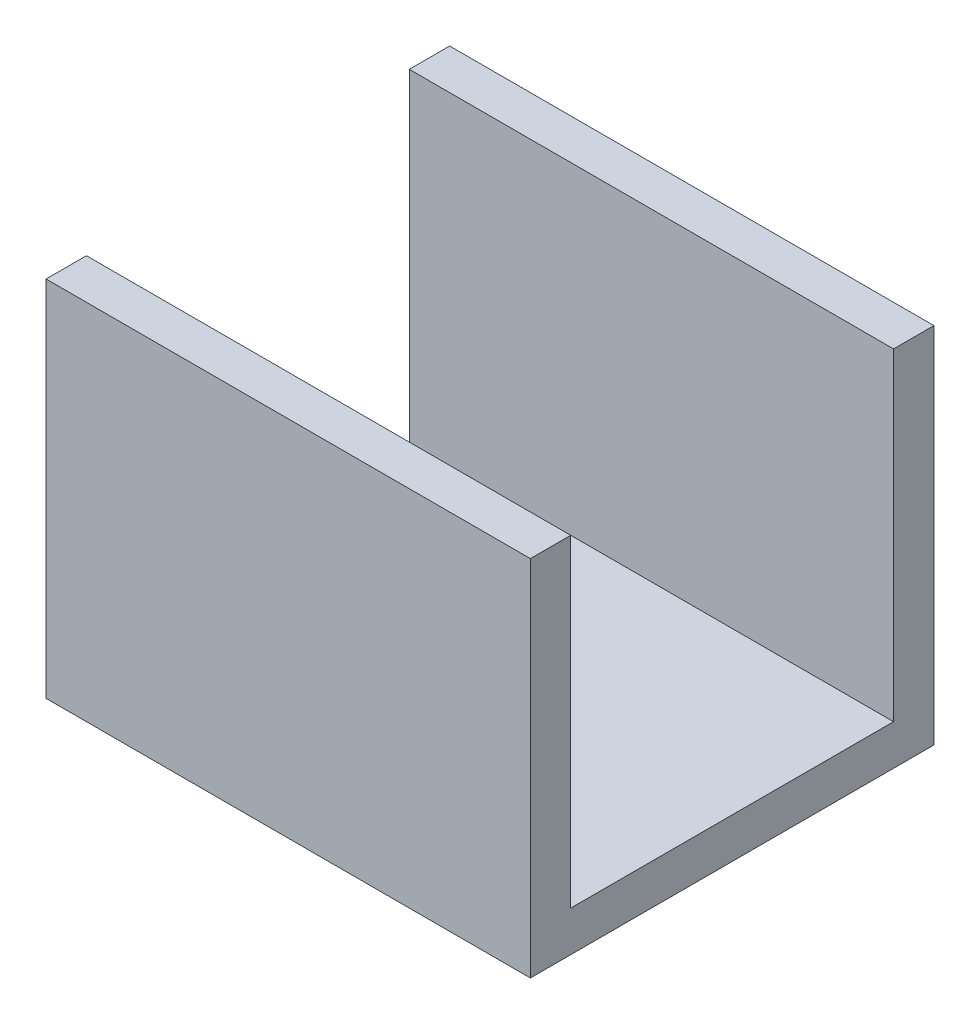
ISO-10303-21;
HEADER;
FILE_DESCRIPTION(('STEP AP214'),'2;1');
FILE_NAME('part.step','',(''),(''),'','','');
FILE_SCHEMA(('AUTOMOTIVE_DESIGN { 1 0 10303 214 1 1 1 1 }'));
ENDSEC;
DATA;
#1=APPLICATION_CONTEXT('core data for automotive mechanical design processes');
#2=APPLICATION_PROTOCOL_DEFINITION('international standard','automotive_design',2000,#1);
#3=PRODUCT_CONTEXT('',#1,'mechanical');
#4=PRODUCT('Part','Part','',(#3));
#5=PRODUCT_RELATED_PRODUCT_CATEGORY('part','',(#4));
#6=PRODUCT_DEFINITION_FORMATION('','',#4);
#7=PRODUCT_DEFINITION_CONTEXT('part definition',#1,'design');
#8=PRODUCT_DEFINITION('design','',#6,#7);
#9=PRODUCT_DEFINITION_SHAPE('','',#8);
#10=(LENGTH_UNIT() NAMED_UNIT(*) SI_UNIT(.MILLI.,.METRE.));
#11=(NAMED_UNIT(*) PLANE_ANGLE_UNIT() SI_UNIT($,.RADIAN.));
#12=(NAMED_UNIT(*) SI_UNIT($,.STERADIAN.) SOLID_ANGLE_UNIT());
#13=UNCERTAINTY_MEASURE_WITH_UNIT(LENGTH_MEASURE(1.E-05),#10,'distance_accuracy_value','');
#14=(GEOMETRIC_REPRESENTATION_CONTEXT(3) GLOBAL_UNCERTAINTY_ASSIGNED_CONTEXT((#13)) GLOBAL_UNIT_ASSIGNED_CONTEXT((#10,
#11,#12)) REPRESENTATION_CONTEXT('',''));
#15=CARTESIAN_POINT('',(0.,0.,0.));
#16=DIRECTION('',(0.,0.,1.));
#17=DIRECTION('',(1.,0.,0.));
#18=AXIS2_PLACEMENT_3D('',#15,#16,#17);
#19=CARTESIAN_POINT('',(0.,6.35,0.));
#20=DIRECTION('',(0.,-1.,0.));
#21=DIRECTION('',(0.,0.,-1.));
#22=AXIS2_PLACEMENT_3D('',#19,#20,#21);
#23=PLANE('',#22);
#24=DIRECTION('',(-1.,0.,0.));
#25=VECTOR('',#24,1.);
#26=CARTESIAN_POINT('',(-38.1,6.35,25.4));
#27=LINE('',#26,#25);
#28=CARTESIAN_POINT('',(38.1,6.35,25.4));
#29=VERTEX_POINT('',#28);
#30=CARTESIAN_POINT('',(-38.1,6.35,25.4));
#31=VERTEX_POINT('',#30);
#32=EDGE_CURVE('E54',#29,#31,#27,.T.);
#33=ORIENTED_EDGE('',*,*,#32,.F.);
#34=DIRECTION('',(0.,0.,-1.));
#35=VECTOR('',#34,1.);
#36=CARTESIAN_POINT('',(38.1,6.35,31.75));
#37=LINE('',#36,#35);
#38=CARTESIAN_POINT('',(38.1,6.35,-25.4));
#39=VERTEX_POINT('',#38);
#40=EDGE_CURVE('E151',#29,#39,#37,.T.);
#41=ORIENTED_EDGE('',*,*,#40,.T.);
#42=DIRECTION('',(1.,0.,0.));
#43=VECTOR('',#42,1.);
#44=CARTESIAN_POINT('',(-38.1,6.35,-25.4));
#45=LINE('',#44,#43);
#46=CARTESIAN_POINT('',(-38.1,6.35,-25.4));
#47=VERTEX_POINT('',#46);
#48=EDGE_CURVE('E126',#47,#39,#45,.T.);
#49=ORIENTED_EDGE('',*,*,#48,.F.);
#50=DIRECTION('',(0.,0.,1.));
#51=VECTOR('',#50,1.);
#52=CARTESIAN_POINT('',(-38.1,6.35,31.75));
#53=LINE('',#52,#51);
#54=EDGE_CURVE('E59',#47,#31,#53,.T.);
#55=ORIENTED_EDGE('',*,*,#54,.T.);
#56=EDGE_LOOP('',(#33,#41,#49,#55));
#57=FACE_BOUND('',#56,.T.);
#58=ADVANCED_FACE('F39',(#57),#23,.F.);
#59=CARTESIAN_POINT('',(38.1,6.35,31.75));
#60=DIRECTION('',(-1.,0.,0.));
#61=DIRECTION('',(0.,0.,1.));
#62=AXIS2_PLACEMENT_3D('',#59,#60,#61);
#63=PLANE('',#62);
#64=DIRECTION('',(0.,0.,-1.));
#65=VECTOR('',#64,1.);
#66=CARTESIAN_POINT('',(38.1,0.,31.75));
#67=LINE('',#66,#65);
#68=CARTESIAN_POINT('',(38.1,0.,31.75));
#69=VERTEX_POINT('',#68);
#70=CARTESIAN_POINT('',(38.1,0.,-31.75));
#71=VERTEX_POINT('',#70);
#72=EDGE_CURVE('E150',#69,#71,#67,.T.);
#73=ORIENTED_EDGE('',*,*,#72,.T.);
#74=DIRECTION('',(0.,-1.,0.));
#75=VECTOR('',#74,1.);
#76=CARTESIAN_POINT('',(38.1,6.35,-31.75));
#77=LINE('',#76,#75);
#78=CARTESIAN_POINT('',(38.1,57.15,-31.75));
#79=VERTEX_POINT('',#78);
#80=EDGE_CURVE('E11',#79,#71,#77,.T.);
#81=ORIENTED_EDGE('',*,*,#80,.F.);
#82=DIRECTION('',(0.,0.,-1.));
#83=VECTOR('',#82,1.);
#84=CARTESIAN_POINT('',(38.1,57.15,-31.75));
#85=LINE('',#84,#83);
#86=CARTESIAN_POINT('',(38.1,57.15,-25.4));
#87=VERTEX_POINT('',#86);
#88=EDGE_CURVE('E136',#87,#79,#85,.T.);
#89=ORIENTED_EDGE('',*,*,#88,.F.);
#90=DIRECTION('',(0.,-1.,0.));
#91=VECTOR('',#90,1.);
#92=CARTESIAN_POINT('',(38.1,57.15,-25.4));
#93=LINE('',#92,#91);
#94=EDGE_CURVE('E142',#87,#39,#93,.T.);
#95=ORIENTED_EDGE('',*,*,#94,.T.);
#96=ORIENTED_EDGE('',*,*,#40,.F.);
#97=DIRECTION('',(0.,-1.,0.));
#98=VECTOR('',#97,1.);
#99=CARTESIAN_POINT('',(38.1,57.15,25.4));
#100=LINE('',#99,#98);
#101=CARTESIAN_POINT('',(38.1,57.15,25.4));
#102=VERTEX_POINT('',#101);
#103=EDGE_CURVE('E118',#102,#29,#100,.T.);
#104=ORIENTED_EDGE('',*,*,#103,.F.);
#105=DIRECTION('',(0.,0.,-1.));
#106=VECTOR('',#105,1.);
#107=CARTESIAN_POINT('',(38.1,57.15,25.4));
#108=LINE('',#107,#106);
#109=CARTESIAN_POINT('',(38.1,57.15,31.75));
#110=VERTEX_POINT('',#109);
#111=EDGE_CURVE('E109',#110,#102,#108,.T.);
#112=ORIENTED_EDGE('',*,*,#111,.F.);
#113=DIRECTION('',(0.,-1.,0.));
#114=VECTOR('',#113,1.);
#115=CARTESIAN_POINT('',(38.1,6.35,31.75));
#116=LINE('',#115,#114);
#117=EDGE_CURVE('E155',#110,#69,#116,.T.);
#118=ORIENTED_EDGE('',*,*,#117,.T.);
#119=EDGE_LOOP('',(#73,#81,#89,#95,#96,#104,#112,#118));
#120=FACE_BOUND('',#119,.T.);
#121=ADVANCED_FACE('F41',(#120),#63,.F.);
#122=CARTESIAN_POINT('',(-38.1,6.35,-31.75));
#123=DIRECTION('',(0.,0.,1.));
#124=DIRECTION('',(1.,0.,0.));
#125=AXIS2_PLACEMENT_3D('',#122,#123,#124);
#126=PLANE('',#125);
#127=DIRECTION('',(-1.,0.,0.));
#128=VECTOR('',#127,1.);
#129=CARTESIAN_POINT('',(-38.1,0.,-31.75));
#130=LINE('',#129,#128);
#131=CARTESIAN_POINT('',(-38.1,0.,-31.75));
#132=VERTEX_POINT('',#131);
#133=EDGE_CURVE('E158',#71,#132,#130,.T.);
#134=ORIENTED_EDGE('',*,*,#133,.T.);
#135=DIRECTION('',(0.,-1.,0.));
#136=VECTOR('',#135,1.);
#137=CARTESIAN_POINT('',(-38.1,6.35,-31.75));
#138=LINE('',#137,#136);
#139=CARTESIAN_POINT('',(-38.1,57.15,-31.75));
#140=VERTEX_POINT('',#139);
#141=EDGE_CURVE('E47',#140,#132,#138,.T.);
#142=ORIENTED_EDGE('',*,*,#141,.F.);
#143=DIRECTION('',(-1.,0.,0.));
#144=VECTOR('',#143,1.);
#145=CARTESIAN_POINT('',(-38.1,57.15,-31.75));
#146=LINE('',#145,#144);
#147=EDGE_CURVE('E139',#79,#140,#146,.T.);
#148=ORIENTED_EDGE('',*,*,#147,.F.);
#149=ORIENTED_EDGE('',*,*,#80,.T.);
#150=EDGE_LOOP('',(#134,#142,#148,#149));
#151=FACE_BOUND('',#150,.T.);
#152=ADVANCED_FACE('F211',(#151),#126,.F.);
#153=CARTESIAN_POINT('',(-38.1,6.35,31.75));
#154=DIRECTION('',(1.,0.,0.));
#155=DIRECTION('',(0.,0.,-1.));
#156=AXIS2_PLACEMENT_3D('',#153,#154,#155);
#157=PLANE('',#156);
#158=DIRECTION('',(0.,0.,1.));
#159=VECTOR('',#158,1.);
#160=CARTESIAN_POINT('',(-38.1,0.,31.75));
#161=LINE('',#160,#159);
#162=CARTESIAN_POINT('',(-38.1,0.,31.75));
#163=VERTEX_POINT('',#162);
#164=EDGE_CURVE('E160',#132,#163,#161,.T.);
#165=ORIENTED_EDGE('',*,*,#164,.T.);
#166=DIRECTION('',(0.,-1.,0.));
#167=VECTOR('',#166,1.);
#168=CARTESIAN_POINT('',(-38.1,6.35,31.75));
#169=LINE('',#168,#167);
#170=CARTESIAN_POINT('',(-38.1,57.15,31.75));
#171=VERTEX_POINT('',#170);
#172=EDGE_CURVE('E122',#171,#163,#169,.T.);
#173=ORIENTED_EDGE('',*,*,#172,.F.);
#174=DIRECTION('',(0.,0.,1.));
#175=VECTOR('',#174,1.);
#176=CARTESIAN_POINT('',(-38.1,57.15,25.4));
#177=LINE('',#176,#175);
#178=CARTESIAN_POINT('',(-38.1,57.15,25.4));
#179=VERTEX_POINT('',#178);
#180=EDGE_CURVE('E107',#179,#171,#177,.T.);
#181=ORIENTED_EDGE('',*,*,#180,.F.);
#182=DIRECTION('',(0.,-1.,0.));
#183=VECTOR('',#182,1.);
#184=CARTESIAN_POINT('',(-38.1,57.15,25.4));
#185=LINE('',#184,#183);
#186=EDGE_CURVE('E113',#179,#31,#185,.T.);
#187=ORIENTED_EDGE('',*,*,#186,.T.);
#188=ORIENTED_EDGE('',*,*,#54,.F.);
#189=DIRECTION('',(0.,-1.,0.));
#190=VECTOR('',#189,1.);
#191=CARTESIAN_POINT('',(-38.1,57.15,-25.4));
#192=LINE('',#191,#190);
#193=CARTESIAN_POINT('',(-38.1,57.15,-25.4));
#194=VERTEX_POINT('',#193);
#195=EDGE_CURVE('E147',#194,#47,#192,.T.);
#196=ORIENTED_EDGE('',*,*,#195,.F.);
#197=DIRECTION('',(0.,0.,1.));
#198=VECTOR('',#197,1.);
#199=CARTESIAN_POINT('',(-38.1,57.15,-31.75));
#200=LINE('',#199,#198);
#201=EDGE_CURVE('E131',#140,#194,#200,.T.);
#202=ORIENTED_EDGE('',*,*,#201,.F.);
#203=ORIENTED_EDGE('',*,*,#141,.T.);
#204=EDGE_LOOP('',(#165,#173,#181,#187,#188,#196,#202,#203));
#205=FACE_BOUND('',#204,.T.);
#206=ADVANCED_FACE('F120',(#205),#157,.F.);
#207=CARTESIAN_POINT('',(-38.1,6.35,31.75));
#208=DIRECTION('',(0.,0.,-1.));
#209=DIRECTION('',(-1.,0.,0.));
#210=AXIS2_PLACEMENT_3D('',#207,#208,#209);
#211=PLANE('',#210);
#212=DIRECTION('',(1.,0.,0.));
#213=VECTOR('',#212,1.);
#214=CARTESIAN_POINT('',(-38.1,0.,31.75));
#215=LINE('',#214,#213);
#216=EDGE_CURVE('E153',#163,#69,#215,.T.);
#217=ORIENTED_EDGE('',*,*,#216,.T.);
#218=ORIENTED_EDGE('',*,*,#117,.F.);
#219=DIRECTION('',(1.,0.,0.));
#220=VECTOR('',#219,1.);
#221=CARTESIAN_POINT('',(-38.1,57.15,31.75));
#222=LINE('',#221,#220);
#223=EDGE_CURVE('E124',#171,#110,#222,.T.);
#224=ORIENTED_EDGE('',*,*,#223,.F.);
#225=ORIENTED_EDGE('',*,*,#172,.T.);
#226=EDGE_LOOP('',(#217,#218,#224,#225));
#227=FACE_BOUND('',#226,.T.);
#228=ADVANCED_FACE('F176',(#227),#211,.F.);
#229=CARTESIAN_POINT('',(0.,0.,0.));
#230=DIRECTION('',(0.,-1.,0.));
#231=DIRECTION('',(0.,0.,-1.));
#232=AXIS2_PLACEMENT_3D('',#229,#230,#231);
#233=PLANE('',#232);
#234=CARTESIAN_POINT('',(0.,0.,0.));
#235=DIRECTION('',(0.,-1.,0.));
#236=DIRECTION('',(0.,0.,-1.));
#237=AXIS2_PLACEMENT_3D('',#234,#235,#236);
#238=CIRCLE('',#237,3.175);
#239=CARTESIAN_POINT('',(0.,0.,-3.175));
#240=VERTEX_POINT('',#239);
#241=EDGE_CURVE('E181',#240,#240,#238,.T.);
#242=ORIENTED_EDGE('',*,*,#241,.F.);
#243=EDGE_LOOP('',(#242));
#244=FACE_BOUND('',#243,.T.);
#245=ORIENTED_EDGE('',*,*,#72,.F.);
#246=ORIENTED_EDGE('',*,*,#216,.F.);
#247=ORIENTED_EDGE('',*,*,#164,.F.);
#248=ORIENTED_EDGE('',*,*,#133,.F.);
#249=EDGE_LOOP('',(#245,#246,#247,#248));
#250=FACE_BOUND('',#249,.T.);
#251=ADVANCED_FACE('F174',(#244,#250),#233,.T.);
#252=CARTESIAN_POINT('',(-38.1,57.15,-25.4));
#253=DIRECTION('',(0.,0.,-1.));
#254=DIRECTION('',(-1.,0.,0.));
#255=AXIS2_PLACEMENT_3D('',#252,#253,#254);
#256=PLANE('',#255);
#257=ORIENTED_EDGE('',*,*,#48,.T.);
#258=ORIENTED_EDGE('',*,*,#94,.F.);
#259=DIRECTION('',(1.,0.,0.));
#260=VECTOR('',#259,1.);
#261=CARTESIAN_POINT('',(-38.1,57.15,-25.4));
#262=LINE('',#261,#260);
#263=EDGE_CURVE('E134',#194,#87,#262,.T.);
#264=ORIENTED_EDGE('',*,*,#263,.F.);
#265=ORIENTED_EDGE('',*,*,#195,.T.);
#266=EDGE_LOOP('',(#257,#258,#264,#265));
#267=FACE_BOUND('',#266,.T.);
#268=ADVANCED_FACE('F196',(#267),#256,.F.);
#269=CARTESIAN_POINT('',(0.,57.15,0.));
#270=DIRECTION('',(0.,1.,0.));
#271=DIRECTION('',(0.,0.,1.));
#272=AXIS2_PLACEMENT_3D('',#269,#270,#271);
#273=PLANE('',#272);
#274=ORIENTED_EDGE('',*,*,#201,.T.);
#275=ORIENTED_EDGE('',*,*,#263,.T.);
#276=ORIENTED_EDGE('',*,*,#88,.T.);
#277=ORIENTED_EDGE('',*,*,#147,.T.);
#278=EDGE_LOOP('',(#274,#275,#276,#277));
#279=FACE_BOUND('',#278,.T.);
#280=ADVANCED_FACE('F202',(#279),#273,.T.);
#281=CARTESIAN_POINT('',(-38.1,57.15,25.4));
#282=DIRECTION('',(0.,0.,1.));
#283=DIRECTION('',(1.,0.,0.));
#284=AXIS2_PLACEMENT_3D('',#281,#282,#283);
#285=PLANE('',#284);
#286=ORIENTED_EDGE('',*,*,#32,.T.);
#287=ORIENTED_EDGE('',*,*,#186,.F.);
#288=DIRECTION('',(-1.,0.,0.));
#289=VECTOR('',#288,1.);
#290=CARTESIAN_POINT('',(-38.1,57.15,25.4));
#291=LINE('',#290,#289);
#292=EDGE_CURVE('E102',#102,#179,#291,.T.);
#293=ORIENTED_EDGE('',*,*,#292,.F.);
#294=ORIENTED_EDGE('',*,*,#103,.T.);
#295=EDGE_LOOP('',(#286,#287,#293,#294));
#296=FACE_BOUND('',#295,.T.);
#297=ADVANCED_FACE('F116',(#296),#285,.F.);
#298=CARTESIAN_POINT('',(0.,57.15,0.));
#299=DIRECTION('',(0.,1.,0.));
#300=DIRECTION('',(0.,0.,1.));
#301=AXIS2_PLACEMENT_3D('',#298,#299,#300);
#302=PLANE('',#301);
#303=ORIENTED_EDGE('',*,*,#180,.T.);
#304=ORIENTED_EDGE('',*,*,#223,.T.);
#305=ORIENTED_EDGE('',*,*,#111,.T.);
#306=ORIENTED_EDGE('',*,*,#292,.T.);
#307=EDGE_LOOP('',(#303,#304,#305,#306));
#308=FACE_BOUND('',#307,.T.);
#309=ADVANCED_FACE('F104',(#308),#302,.T.);
#310=CARTESIAN_POINT('',(0.,-25.4,0.));
#311=DIRECTION('',(0.,1.,0.));
#312=DIRECTION('',(0.,0.,1.));
#313=AXIS2_PLACEMENT_3D('',#310,#311,#312);
#314=CYLINDRICAL_SURFACE('',#313,3.175);
#315=CARTESIAN_POINT('',(0.,-25.4,0.));
#316=DIRECTION('',(0.,-1.,0.));
#317=DIRECTION('',(0.,0.,-1.));
#318=AXIS2_PLACEMENT_3D('',#315,#316,#317);
#319=CIRCLE('',#318,3.175);
#320=CARTESIAN_POINT('',(0.,-25.4,-3.175));
#321=VERTEX_POINT('',#320);
#322=EDGE_CURVE('E180',#321,#321,#319,.T.);
#323=ORIENTED_EDGE('',*,*,#322,.F.);
#324=EDGE_LOOP('',(#323));
#325=FACE_BOUND('',#324,.T.);
#326=ORIENTED_EDGE('',*,*,#241,.T.);
#327=EDGE_LOOP('',(#326));
#328=FACE_BOUND('',#327,.T.);
#329=ADVANCED_FACE('F189',(#325,#328),#314,.T.);
#330=CARTESIAN_POINT('',(0.,-25.4,0.));
#331=DIRECTION('',(0.,-1.,0.));
#332=DIRECTION('',(0.,0.,-1.));
#333=AXIS2_PLACEMENT_3D('',#330,#331,#332);
#334=PLANE('',#333);
#335=ORIENTED_EDGE('',*,*,#322,.T.);
#336=EDGE_LOOP('',(#335));
#337=FACE_BOUND('',#336,.T.);
#338=ADVANCED_FACE('F187',(#337),#334,.T.);
#339=CLOSED_SHELL('',(#58,#121,#152,#206,#228,#251,#268,#280,#297,#309,#329,#338));
#340=MANIFOLD_SOLID_BREP('B2',#339);
#341=ADVANCED_BREP_SHAPE_REPRESENTATION('',(#18,#340),#14);
#342=SHAPE_DEFINITION_REPRESENTATION(#9,#341);
ENDSEC;
END-ISO-10303-21;
